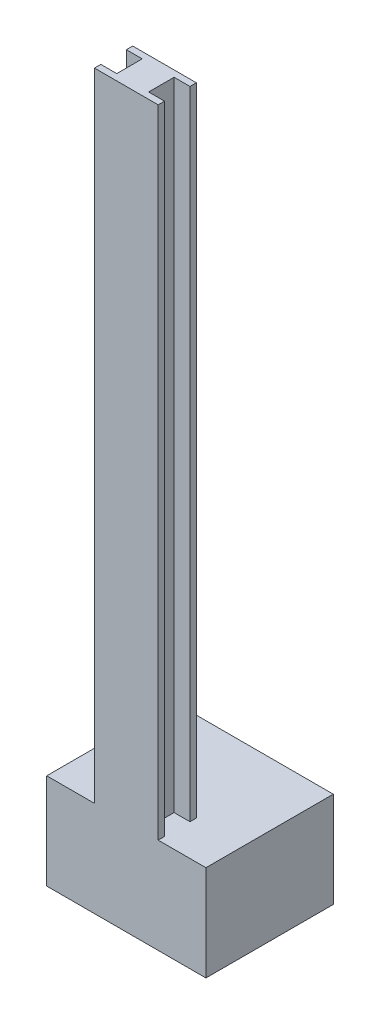
ISO-10303-21;
HEADER;
FILE_DESCRIPTION(('STEP AP214'),'2;1');
FILE_NAME('part.step','',(''),(''),'','','');
FILE_SCHEMA(('AUTOMOTIVE_DESIGN { 1 0 10303 214 1 1 1 1 }'));
ENDSEC;
DATA;
#1=APPLICATION_CONTEXT('core data for automotive mechanical design processes');
#2=APPLICATION_PROTOCOL_DEFINITION('international standard','automotive_design',2000,#1);
#3=PRODUCT_CONTEXT('',#1,'mechanical');
#4=PRODUCT('Part','Part','',(#3));
#5=PRODUCT_RELATED_PRODUCT_CATEGORY('part','',(#4));
#6=PRODUCT_DEFINITION_FORMATION('','',#4);
#7=PRODUCT_DEFINITION_CONTEXT('part definition',#1,'design');
#8=PRODUCT_DEFINITION('design','',#6,#7);
#9=PRODUCT_DEFINITION_SHAPE('','',#8);
#10=(LENGTH_UNIT() NAMED_UNIT(*) SI_UNIT(.MILLI.,.METRE.));
#11=(NAMED_UNIT(*) PLANE_ANGLE_UNIT() SI_UNIT($,.RADIAN.));
#12=(NAMED_UNIT(*) SI_UNIT($,.STERADIAN.) SOLID_ANGLE_UNIT());
#13=UNCERTAINTY_MEASURE_WITH_UNIT(LENGTH_MEASURE(1.E-05),#10,'distance_accuracy_value','');
#14=(GEOMETRIC_REPRESENTATION_CONTEXT(3) GLOBAL_UNCERTAINTY_ASSIGNED_CONTEXT((#13)) GLOBAL_UNIT_ASSIGNED_CONTEXT((#10,
#11,#12)) REPRESENTATION_CONTEXT('',''));
#15=CARTESIAN_POINT('',(0.,0.,0.));
#16=DIRECTION('',(0.,0.,1.));
#17=DIRECTION('',(1.,0.,0.));
#18=AXIS2_PLACEMENT_3D('',#15,#16,#17);
#19=CARTESIAN_POINT('',(0.,30.,0.));
#20=DIRECTION('',(0.,-1.,0.));
#21=DIRECTION('',(0.,0.,-1.));
#22=AXIS2_PLACEMENT_3D('',#19,#20,#21);
#23=PLANE('',#22);
#24=DIRECTION('',(0.,0.,1.));
#25=VECTOR('',#24,1.);
#26=CARTESIAN_POINT('',(-10.,30.,20.));
#27=LINE('',#26,#25);
#28=CARTESIAN_POINT('',(-10.,30.,18.));
#29=VERTEX_POINT('',#28);
#30=CARTESIAN_POINT('',(-10.,30.,20.));
#31=VERTEX_POINT('',#30);
#32=EDGE_CURVE('E59',#29,#31,#27,.T.);
#33=ORIENTED_EDGE('',*,*,#32,.F.);
#34=DIRECTION('',(-1.,0.,0.));
#35=VECTOR('',#34,1.);
#36=CARTESIAN_POINT('',(-5.,30.,18.));
#37=LINE('',#36,#35);
#38=CARTESIAN_POINT('',(-5.,30.,18.));
#39=VERTEX_POINT('',#38);
#40=EDGE_CURVE('E63',#39,#29,#37,.T.);
#41=ORIENTED_EDGE('',*,*,#40,.F.);
#42=DIRECTION('',(0.,0.,1.));
#43=VECTOR('',#42,1.);
#44=CARTESIAN_POINT('',(-5.,30.,10.));
#45=LINE('',#44,#43);
#46=CARTESIAN_POINT('',(-5.,30.,10.));
#47=VERTEX_POINT('',#46);
#48=EDGE_CURVE('E308',#47,#39,#45,.T.);
#49=ORIENTED_EDGE('',*,*,#48,.F.);
#50=DIRECTION('',(1.,0.,0.));
#51=VECTOR('',#50,1.);
#52=CARTESIAN_POINT('',(-10.,30.,10.));
#53=LINE('',#52,#51);
#54=CARTESIAN_POINT('',(-10.,30.,10.));
#55=VERTEX_POINT('',#54);
#56=EDGE_CURVE('E304',#55,#47,#53,.T.);
#57=ORIENTED_EDGE('',*,*,#56,.F.);
#58=DIRECTION('',(0.,0.,1.));
#59=VECTOR('',#58,1.);
#60=CARTESIAN_POINT('',(-10.,30.,10.));
#61=LINE('',#60,#59);
#62=CARTESIAN_POINT('',(-10.,30.,8.));
#63=VERTEX_POINT('',#62);
#64=EDGE_CURVE('E300',#63,#55,#61,.T.);
#65=ORIENTED_EDGE('',*,*,#64,.F.);
#66=DIRECTION('',(-1.,0.,0.));
#67=VECTOR('',#66,1.);
#68=CARTESIAN_POINT('',(-10.,30.,8.));
#69=LINE('',#68,#67);
#70=CARTESIAN_POINT('',(10.,30.,8.));
#71=VERTEX_POINT('',#70);
#72=EDGE_CURVE('E296',#71,#63,#69,.T.);
#73=ORIENTED_EDGE('',*,*,#72,.F.);
#74=DIRECTION('',(0.,0.,-1.));
#75=VECTOR('',#74,1.);
#76=CARTESIAN_POINT('',(10.,30.,10.));
#77=LINE('',#76,#75);
#78=CARTESIAN_POINT('',(10.,30.,10.));
#79=VERTEX_POINT('',#78);
#80=EDGE_CURVE('E292',#79,#71,#77,.T.);
#81=ORIENTED_EDGE('',*,*,#80,.F.);
#82=DIRECTION('',(1.,0.,0.));
#83=VECTOR('',#82,1.);
#84=CARTESIAN_POINT('',(10.,30.,10.));
#85=LINE('',#84,#83);
#86=CARTESIAN_POINT('',(5.,30.,10.));
#87=VERTEX_POINT('',#86);
#88=EDGE_CURVE('E288',#87,#79,#85,.T.);
#89=ORIENTED_EDGE('',*,*,#88,.F.);
#90=DIRECTION('',(0.,0.,-1.));
#91=VECTOR('',#90,1.);
#92=CARTESIAN_POINT('',(5.,30.,10.));
#93=LINE('',#92,#91);
#94=CARTESIAN_POINT('',(5.,30.,18.));
#95=VERTEX_POINT('',#94);
#96=EDGE_CURVE('E284',#95,#87,#93,.T.);
#97=ORIENTED_EDGE('',*,*,#96,.F.);
#98=DIRECTION('',(-1.,0.,0.));
#99=VECTOR('',#98,1.);
#100=CARTESIAN_POINT('',(5.,30.,18.));
#101=LINE('',#100,#99);
#102=CARTESIAN_POINT('',(10.,30.,18.));
#103=VERTEX_POINT('',#102);
#104=EDGE_CURVE('E280',#103,#95,#101,.T.);
#105=ORIENTED_EDGE('',*,*,#104,.F.);
#106=DIRECTION('',(0.,0.,-1.));
#107=VECTOR('',#106,1.);
#108=CARTESIAN_POINT('',(10.,30.,20.));
#109=LINE('',#108,#107);
#110=CARTESIAN_POINT('',(10.,30.,20.));
#111=VERTEX_POINT('',#110);
#112=EDGE_CURVE('E239',#111,#103,#109,.T.);
#113=ORIENTED_EDGE('',*,*,#112,.F.);
#114=DIRECTION('',(1.,0.,0.));
#115=VECTOR('',#114,1.);
#116=CARTESIAN_POINT('',(-25.,30.,20.));
#117=LINE('',#116,#115);
#118=CARTESIAN_POINT('',(25.,30.,20.));
#119=VERTEX_POINT('',#118);
#120=EDGE_CURVE('E203',#111,#119,#117,.T.);
#121=ORIENTED_EDGE('',*,*,#120,.T.);
#122=DIRECTION('',(0.,0.,-1.));
#123=VECTOR('',#122,1.);
#124=CARTESIAN_POINT('',(25.,30.,20.));
#125=LINE('',#124,#123);
#126=CARTESIAN_POINT('',(25.,30.,-20.));
#127=VERTEX_POINT('',#126);
#128=EDGE_CURVE('E192',#119,#127,#125,.T.);
#129=ORIENTED_EDGE('',*,*,#128,.T.);
#130=DIRECTION('',(-1.,0.,0.));
#131=VECTOR('',#130,1.);
#132=CARTESIAN_POINT('',(-25.,30.,-20.));
#133=LINE('',#132,#131);
#134=CARTESIAN_POINT('',(-25.,30.,-20.));
#135=VERTEX_POINT('',#134);
#136=EDGE_CURVE('E196',#127,#135,#133,.T.);
#137=ORIENTED_EDGE('',*,*,#136,.T.);
#138=DIRECTION('',(0.,0.,1.));
#139=VECTOR('',#138,1.);
#140=CARTESIAN_POINT('',(-25.,30.,20.));
#141=LINE('',#140,#139);
#142=CARTESIAN_POINT('',(-25.,30.,20.));
#143=VERTEX_POINT('',#142);
#144=EDGE_CURVE('E200',#135,#143,#141,.T.);
#145=ORIENTED_EDGE('',*,*,#144,.T.);
#146=EDGE_CURVE('E204',#143,#31,#117,.T.);
#147=ORIENTED_EDGE('',*,*,#146,.T.);
#148=EDGE_LOOP('',(#33,#41,#49,#57,#65,#73,#81,#89,#97,#105,#113,#121,#129,#137,#145,#147));
#149=FACE_BOUND('',#148,.T.);
#150=ADVANCED_FACE('F43',(#149),#23,.F.);
#151=CARTESIAN_POINT('',(25.,30.,20.));
#152=DIRECTION('',(-1.,0.,0.));
#153=DIRECTION('',(0.,0.,1.));
#154=AXIS2_PLACEMENT_3D('',#151,#152,#153);
#155=PLANE('',#154);
#156=DIRECTION('',(0.,0.,-1.));
#157=VECTOR('',#156,1.);
#158=CARTESIAN_POINT('',(25.,0.,20.));
#159=LINE('',#158,#157);
#160=CARTESIAN_POINT('',(25.,0.,20.));
#161=VERTEX_POINT('',#160);
#162=CARTESIAN_POINT('',(25.,0.,-20.));
#163=VERTEX_POINT('',#162);
#164=EDGE_CURVE('E181',#161,#163,#159,.T.);
#165=ORIENTED_EDGE('',*,*,#164,.T.);
#166=DIRECTION('',(0.,-1.,0.));
#167=VECTOR('',#166,1.);
#168=CARTESIAN_POINT('',(25.,30.,-20.));
#169=LINE('',#168,#167);
#170=EDGE_CURVE('E11',#127,#163,#169,.T.);
#171=ORIENTED_EDGE('',*,*,#170,.F.);
#172=ORIENTED_EDGE('',*,*,#128,.F.);
#173=DIRECTION('',(0.,-1.,0.));
#174=VECTOR('',#173,1.);
#175=CARTESIAN_POINT('',(25.,30.,20.));
#176=LINE('',#175,#174);
#177=EDGE_CURVE('E206',#119,#161,#176,.T.);
#178=ORIENTED_EDGE('',*,*,#177,.T.);
#179=EDGE_LOOP('',(#165,#171,#172,#178));
#180=FACE_BOUND('',#179,.T.);
#181=ADVANCED_FACE('F45',(#180),#155,.F.);
#182=CARTESIAN_POINT('',(-25.,30.,-20.));
#183=DIRECTION('',(0.,0.,1.));
#184=DIRECTION('',(1.,0.,0.));
#185=AXIS2_PLACEMENT_3D('',#182,#183,#184);
#186=PLANE('',#185);
#187=DIRECTION('',(-1.,0.,0.));
#188=VECTOR('',#187,1.);
#189=CARTESIAN_POINT('',(-25.,0.,-20.));
#190=LINE('',#189,#188);
#191=CARTESIAN_POINT('',(-25.,0.,-20.));
#192=VERTEX_POINT('',#191);
#193=EDGE_CURVE('E186',#163,#192,#190,.T.);
#194=ORIENTED_EDGE('',*,*,#193,.T.);
#195=DIRECTION('',(0.,-1.,0.));
#196=VECTOR('',#195,1.);
#197=CARTESIAN_POINT('',(-25.,30.,-20.));
#198=LINE('',#197,#196);
#199=EDGE_CURVE('E52',#135,#192,#198,.T.);
#200=ORIENTED_EDGE('',*,*,#199,.F.);
#201=ORIENTED_EDGE('',*,*,#136,.F.);
#202=ORIENTED_EDGE('',*,*,#170,.T.);
#203=EDGE_LOOP('',(#194,#200,#201,#202));
#204=FACE_BOUND('',#203,.T.);
#205=ADVANCED_FACE('F393',(#204),#186,.F.);
#206=CARTESIAN_POINT('',(-25.,30.,20.));
#207=DIRECTION('',(1.,0.,0.));
#208=DIRECTION('',(0.,0.,-1.));
#209=AXIS2_PLACEMENT_3D('',#206,#207,#208);
#210=PLANE('',#209);
#211=DIRECTION('',(0.,0.,1.));
#212=VECTOR('',#211,1.);
#213=CARTESIAN_POINT('',(-25.,0.,20.));
#214=LINE('',#213,#212);
#215=CARTESIAN_POINT('',(-25.,0.,20.));
#216=VERTEX_POINT('',#215);
#217=EDGE_CURVE('E210',#192,#216,#214,.T.);
#218=ORIENTED_EDGE('',*,*,#217,.T.);
#219=DIRECTION('',(0.,-1.,0.));
#220=VECTOR('',#219,1.);
#221=CARTESIAN_POINT('',(-25.,30.,20.));
#222=LINE('',#221,#220);
#223=EDGE_CURVE('E218',#143,#216,#222,.T.);
#224=ORIENTED_EDGE('',*,*,#223,.F.);
#225=ORIENTED_EDGE('',*,*,#144,.F.);
#226=ORIENTED_EDGE('',*,*,#199,.T.);
#227=EDGE_LOOP('',(#218,#224,#225,#226));
#228=FACE_BOUND('',#227,.T.);
#229=ADVANCED_FACE('F227',(#228),#210,.F.);
#230=CARTESIAN_POINT('',(-25.,30.,20.));
#231=DIRECTION('',(0.,0.,-1.));
#232=DIRECTION('',(-1.,0.,0.));
#233=AXIS2_PLACEMENT_3D('',#230,#231,#232);
#234=PLANE('',#233);
#235=DIRECTION('',(1.,0.,0.));
#236=VECTOR('',#235,1.);
#237=CARTESIAN_POINT('',(-25.,0.,20.));
#238=LINE('',#237,#236);
#239=EDGE_CURVE('E197',#216,#161,#238,.T.);
#240=ORIENTED_EDGE('',*,*,#239,.T.);
#241=ORIENTED_EDGE('',*,*,#177,.F.);
#242=ORIENTED_EDGE('',*,*,#120,.F.);
#243=DIRECTION('',(0.,-1.,0.));
#244=VECTOR('',#243,1.);
#245=CARTESIAN_POINT('',(10.,230.,20.));
#246=LINE('',#245,#244);
#247=CARTESIAN_POINT('',(10.,230.,20.));
#248=VERTEX_POINT('',#247);
#249=EDGE_CURVE('E163',#248,#111,#246,.T.);
#250=ORIENTED_EDGE('',*,*,#249,.F.);
#251=DIRECTION('',(1.,0.,0.));
#252=VECTOR('',#251,1.);
#253=CARTESIAN_POINT('',(-10.,230.,20.));
#254=LINE('',#253,#252);
#255=CARTESIAN_POINT('',(-10.,230.,20.));
#256=VERTEX_POINT('',#255);
#257=EDGE_CURVE('E155',#256,#248,#254,.T.);
#258=ORIENTED_EDGE('',*,*,#257,.F.);
#259=DIRECTION('',(0.,-1.,0.));
#260=VECTOR('',#259,1.);
#261=CARTESIAN_POINT('',(-10.,230.,20.));
#262=LINE('',#261,#260);
#263=EDGE_CURVE('E160',#256,#31,#262,.T.);
#264=ORIENTED_EDGE('',*,*,#263,.T.);
#265=ORIENTED_EDGE('',*,*,#146,.F.);
#266=ORIENTED_EDGE('',*,*,#223,.T.);
#267=EDGE_LOOP('',(#240,#241,#242,#250,#258,#264,#265,#266));
#268=FACE_BOUND('',#267,.T.);
#269=ADVANCED_FACE('F157',(#268),#234,.F.);
#270=CARTESIAN_POINT('',(0.,0.,0.));
#271=DIRECTION('',(0.,-1.,0.));
#272=DIRECTION('',(0.,0.,-1.));
#273=AXIS2_PLACEMENT_3D('',#270,#271,#272);
#274=PLANE('',#273);
#275=ORIENTED_EDGE('',*,*,#164,.F.);
#276=ORIENTED_EDGE('',*,*,#239,.F.);
#277=ORIENTED_EDGE('',*,*,#217,.F.);
#278=ORIENTED_EDGE('',*,*,#193,.F.);
#279=EDGE_LOOP('',(#275,#276,#277,#278));
#280=FACE_BOUND('',#279,.T.);
#281=ADVANCED_FACE('F233',(#280),#274,.T.);
#282=CARTESIAN_POINT('',(-10.,230.,20.));
#283=DIRECTION('',(1.,0.,0.));
#284=DIRECTION('',(0.,0.,-1.));
#285=AXIS2_PLACEMENT_3D('',#282,#283,#284);
#286=PLANE('',#285);
#287=ORIENTED_EDGE('',*,*,#32,.T.);
#288=ORIENTED_EDGE('',*,*,#263,.F.);
#289=DIRECTION('',(0.,0.,1.));
#290=VECTOR('',#289,1.);
#291=CARTESIAN_POINT('',(-10.,230.,20.));
#292=LINE('',#291,#290);
#293=CARTESIAN_POINT('',(-10.,230.,18.));
#294=VERTEX_POINT('',#293);
#295=EDGE_CURVE('E168',#294,#256,#292,.T.);
#296=ORIENTED_EDGE('',*,*,#295,.F.);
#297=DIRECTION('',(0.,-1.,0.));
#298=VECTOR('',#297,1.);
#299=CARTESIAN_POINT('',(-10.,230.,18.));
#300=LINE('',#299,#298);
#301=EDGE_CURVE('E275',#294,#29,#300,.T.);
#302=ORIENTED_EDGE('',*,*,#301,.T.);
#303=EDGE_LOOP('',(#287,#288,#296,#302));
#304=FACE_BOUND('',#303,.T.);
#305=ADVANCED_FACE('F179',(#304),#286,.F.);
#306=CARTESIAN_POINT('',(10.,230.,20.));
#307=DIRECTION('',(-1.,0.,0.));
#308=DIRECTION('',(0.,0.,1.));
#309=AXIS2_PLACEMENT_3D('',#306,#307,#308);
#310=PLANE('',#309);
#311=ORIENTED_EDGE('',*,*,#112,.T.);
#312=DIRECTION('',(0.,-1.,0.));
#313=VECTOR('',#312,1.);
#314=CARTESIAN_POINT('',(10.,230.,18.));
#315=LINE('',#314,#313);
#316=CARTESIAN_POINT('',(10.,230.,18.));
#317=VERTEX_POINT('',#316);
#318=EDGE_CURVE('E188',#317,#103,#315,.T.);
#319=ORIENTED_EDGE('',*,*,#318,.F.);
#320=DIRECTION('',(0.,0.,-1.));
#321=VECTOR('',#320,1.);
#322=CARTESIAN_POINT('',(10.,230.,20.));
#323=LINE('',#322,#321);
#324=EDGE_CURVE('E167',#248,#317,#323,.T.);
#325=ORIENTED_EDGE('',*,*,#324,.F.);
#326=ORIENTED_EDGE('',*,*,#249,.T.);
#327=EDGE_LOOP('',(#311,#319,#325,#326));
#328=FACE_BOUND('',#327,.T.);
#329=ADVANCED_FACE('F242',(#328),#310,.F.);
#330=CARTESIAN_POINT('',(5.,230.,18.));
#331=DIRECTION('',(0.,0.,1.));
#332=DIRECTION('',(1.,0.,0.));
#333=AXIS2_PLACEMENT_3D('',#330,#331,#332);
#334=PLANE('',#333);
#335=ORIENTED_EDGE('',*,*,#104,.T.);
#336=DIRECTION('',(0.,-1.,0.));
#337=VECTOR('',#336,1.);
#338=CARTESIAN_POINT('',(5.,230.,18.));
#339=LINE('',#338,#337);
#340=CARTESIAN_POINT('',(5.,230.,18.));
#341=VERTEX_POINT('',#340);
#342=EDGE_CURVE('E343',#341,#95,#339,.T.);
#343=ORIENTED_EDGE('',*,*,#342,.F.);
#344=DIRECTION('',(-1.,0.,0.));
#345=VECTOR('',#344,1.);
#346=CARTESIAN_POINT('',(5.,230.,18.));
#347=LINE('',#346,#345);
#348=EDGE_CURVE('E247',#317,#341,#347,.T.);
#349=ORIENTED_EDGE('',*,*,#348,.F.);
#350=ORIENTED_EDGE('',*,*,#318,.T.);
#351=EDGE_LOOP('',(#335,#343,#349,#350));
#352=FACE_BOUND('',#351,.T.);
#353=ADVANCED_FACE('F348',(#352),#334,.F.);
#354=CARTESIAN_POINT('',(5.,230.,10.));
#355=DIRECTION('',(-1.,0.,0.));
#356=DIRECTION('',(0.,0.,1.));
#357=AXIS2_PLACEMENT_3D('',#354,#355,#356);
#358=PLANE('',#357);
#359=ORIENTED_EDGE('',*,*,#96,.T.);
#360=DIRECTION('',(0.,-1.,0.));
#361=VECTOR('',#360,1.);
#362=CARTESIAN_POINT('',(5.,230.,10.));
#363=LINE('',#362,#361);
#364=CARTESIAN_POINT('',(5.,230.,10.));
#365=VERTEX_POINT('',#364);
#366=EDGE_CURVE('E339',#365,#87,#363,.T.);
#367=ORIENTED_EDGE('',*,*,#366,.F.);
#368=DIRECTION('',(0.,0.,-1.));
#369=VECTOR('',#368,1.);
#370=CARTESIAN_POINT('',(5.,230.,10.));
#371=LINE('',#370,#369);
#372=EDGE_CURVE('E250',#341,#365,#371,.T.);
#373=ORIENTED_EDGE('',*,*,#372,.F.);
#374=ORIENTED_EDGE('',*,*,#342,.T.);
#375=EDGE_LOOP('',(#359,#367,#373,#374));
#376=FACE_BOUND('',#375,.T.);
#377=ADVANCED_FACE('F355',(#376),#358,.F.);
#378=CARTESIAN_POINT('',(10.,230.,10.));
#379=DIRECTION('',(0.,0.,-1.));
#380=DIRECTION('',(-1.,0.,0.));
#381=AXIS2_PLACEMENT_3D('',#378,#379,#380);
#382=PLANE('',#381);
#383=ORIENTED_EDGE('',*,*,#88,.T.);
#384=DIRECTION('',(0.,-1.,0.));
#385=VECTOR('',#384,1.);
#386=CARTESIAN_POINT('',(10.,230.,10.));
#387=LINE('',#386,#385);
#388=CARTESIAN_POINT('',(10.,230.,10.));
#389=VERTEX_POINT('',#388);
#390=EDGE_CURVE('E335',#389,#79,#387,.T.);
#391=ORIENTED_EDGE('',*,*,#390,.F.);
#392=DIRECTION('',(1.,0.,0.));
#393=VECTOR('',#392,1.);
#394=CARTESIAN_POINT('',(10.,230.,10.));
#395=LINE('',#394,#393);
#396=EDGE_CURVE('E255',#365,#389,#395,.T.);
#397=ORIENTED_EDGE('',*,*,#396,.F.);
#398=ORIENTED_EDGE('',*,*,#366,.T.);
#399=EDGE_LOOP('',(#383,#391,#397,#398));
#400=FACE_BOUND('',#399,.T.);
#401=ADVANCED_FACE('F357',(#400),#382,.F.);
#402=CARTESIAN_POINT('',(10.,230.,10.));
#403=DIRECTION('',(-1.,0.,0.));
#404=DIRECTION('',(0.,0.,1.));
#405=AXIS2_PLACEMENT_3D('',#402,#403,#404);
#406=PLANE('',#405);
#407=ORIENTED_EDGE('',*,*,#80,.T.);
#408=DIRECTION('',(0.,-1.,0.));
#409=VECTOR('',#408,1.);
#410=CARTESIAN_POINT('',(10.,230.,8.));
#411=LINE('',#410,#409);
#412=CARTESIAN_POINT('',(10.,230.,8.));
#413=VERTEX_POINT('',#412);
#414=EDGE_CURVE('E331',#413,#71,#411,.T.);
#415=ORIENTED_EDGE('',*,*,#414,.F.);
#416=DIRECTION('',(0.,0.,-1.));
#417=VECTOR('',#416,1.);
#418=CARTESIAN_POINT('',(10.,230.,10.));
#419=LINE('',#418,#417);
#420=EDGE_CURVE('E258',#389,#413,#419,.T.);
#421=ORIENTED_EDGE('',*,*,#420,.F.);
#422=ORIENTED_EDGE('',*,*,#390,.T.);
#423=EDGE_LOOP('',(#407,#415,#421,#422));
#424=FACE_BOUND('',#423,.T.);
#425=ADVANCED_FACE('F361',(#424),#406,.F.);
#426=CARTESIAN_POINT('',(-10.,230.,8.));
#427=DIRECTION('',(0.,0.,1.));
#428=DIRECTION('',(1.,0.,0.));
#429=AXIS2_PLACEMENT_3D('',#426,#427,#428);
#430=PLANE('',#429);
#431=ORIENTED_EDGE('',*,*,#72,.T.);
#432=DIRECTION('',(0.,-1.,0.));
#433=VECTOR('',#432,1.);
#434=CARTESIAN_POINT('',(-10.,230.,8.));
#435=LINE('',#434,#433);
#436=CARTESIAN_POINT('',(-10.,230.,8.));
#437=VERTEX_POINT('',#436);
#438=EDGE_CURVE('E327',#437,#63,#435,.T.);
#439=ORIENTED_EDGE('',*,*,#438,.F.);
#440=DIRECTION('',(-1.,0.,0.));
#441=VECTOR('',#440,1.);
#442=CARTESIAN_POINT('',(-10.,230.,8.));
#443=LINE('',#442,#441);
#444=EDGE_CURVE('E261',#413,#437,#443,.T.);
#445=ORIENTED_EDGE('',*,*,#444,.F.);
#446=ORIENTED_EDGE('',*,*,#414,.T.);
#447=EDGE_LOOP('',(#431,#439,#445,#446));
#448=FACE_BOUND('',#447,.T.);
#449=ADVANCED_FACE('F367',(#448),#430,.F.);
#450=CARTESIAN_POINT('',(-10.,230.,10.));
#451=DIRECTION('',(1.,0.,0.));
#452=DIRECTION('',(0.,0.,-1.));
#453=AXIS2_PLACEMENT_3D('',#450,#451,#452);
#454=PLANE('',#453);
#455=ORIENTED_EDGE('',*,*,#64,.T.);
#456=DIRECTION('',(0.,-1.,0.));
#457=VECTOR('',#456,1.);
#458=CARTESIAN_POINT('',(-10.,230.,10.));
#459=LINE('',#458,#457);
#460=CARTESIAN_POINT('',(-10.,230.,10.));
#461=VERTEX_POINT('',#460);
#462=EDGE_CURVE('E323',#461,#55,#459,.T.);
#463=ORIENTED_EDGE('',*,*,#462,.F.);
#464=DIRECTION('',(0.,0.,1.));
#465=VECTOR('',#464,1.);
#466=CARTESIAN_POINT('',(-10.,230.,10.));
#467=LINE('',#466,#465);
#468=EDGE_CURVE('E264',#437,#461,#467,.T.);
#469=ORIENTED_EDGE('',*,*,#468,.F.);
#470=ORIENTED_EDGE('',*,*,#438,.T.);
#471=EDGE_LOOP('',(#455,#463,#469,#470));
#472=FACE_BOUND('',#471,.T.);
#473=ADVANCED_FACE('F369',(#472),#454,.F.);
#474=CARTESIAN_POINT('',(-10.,230.,10.));
#475=DIRECTION('',(0.,0.,-1.));
#476=DIRECTION('',(-1.,0.,0.));
#477=AXIS2_PLACEMENT_3D('',#474,#475,#476);
#478=PLANE('',#477);
#479=ORIENTED_EDGE('',*,*,#56,.T.);
#480=DIRECTION('',(0.,-1.,0.));
#481=VECTOR('',#480,1.);
#482=CARTESIAN_POINT('',(-5.,230.,10.));
#483=LINE('',#482,#481);
#484=CARTESIAN_POINT('',(-5.,230.,10.));
#485=VERTEX_POINT('',#484);
#486=EDGE_CURVE('E319',#485,#47,#483,.T.);
#487=ORIENTED_EDGE('',*,*,#486,.F.);
#488=DIRECTION('',(1.,0.,0.));
#489=VECTOR('',#488,1.);
#490=CARTESIAN_POINT('',(-10.,230.,10.));
#491=LINE('',#490,#489);
#492=EDGE_CURVE('E267',#461,#485,#491,.T.);
#493=ORIENTED_EDGE('',*,*,#492,.F.);
#494=ORIENTED_EDGE('',*,*,#462,.T.);
#495=EDGE_LOOP('',(#479,#487,#493,#494));
#496=FACE_BOUND('',#495,.T.);
#497=ADVANCED_FACE('F373',(#496),#478,.F.);
#498=CARTESIAN_POINT('',(-5.,230.,10.));
#499=DIRECTION('',(1.,0.,0.));
#500=DIRECTION('',(0.,0.,-1.));
#501=AXIS2_PLACEMENT_3D('',#498,#499,#500);
#502=PLANE('',#501);
#503=ORIENTED_EDGE('',*,*,#48,.T.);
#504=DIRECTION('',(0.,-1.,0.));
#505=VECTOR('',#504,1.);
#506=CARTESIAN_POINT('',(-5.,230.,18.));
#507=LINE('',#506,#505);
#508=CARTESIAN_POINT('',(-5.,230.,18.));
#509=VERTEX_POINT('',#508);
#510=EDGE_CURVE('E315',#509,#39,#507,.T.);
#511=ORIENTED_EDGE('',*,*,#510,.F.);
#512=DIRECTION('',(0.,0.,1.));
#513=VECTOR('',#512,1.);
#514=CARTESIAN_POINT('',(-5.,230.,10.));
#515=LINE('',#514,#513);
#516=EDGE_CURVE('E270',#485,#509,#515,.T.);
#517=ORIENTED_EDGE('',*,*,#516,.F.);
#518=ORIENTED_EDGE('',*,*,#486,.T.);
#519=EDGE_LOOP('',(#503,#511,#517,#518));
#520=FACE_BOUND('',#519,.T.);
#521=ADVANCED_FACE('F377',(#520),#502,.F.);
#522=CARTESIAN_POINT('',(-5.,230.,18.));
#523=DIRECTION('',(0.,0.,1.));
#524=DIRECTION('',(1.,0.,0.));
#525=AXIS2_PLACEMENT_3D('',#522,#523,#524);
#526=PLANE('',#525);
#527=ORIENTED_EDGE('',*,*,#40,.T.);
#528=ORIENTED_EDGE('',*,*,#301,.F.);
#529=DIRECTION('',(-1.,0.,0.));
#530=VECTOR('',#529,1.);
#531=CARTESIAN_POINT('',(-5.,230.,18.));
#532=LINE('',#531,#530);
#533=EDGE_CURVE('E173',#509,#294,#532,.T.);
#534=ORIENTED_EDGE('',*,*,#533,.F.);
#535=ORIENTED_EDGE('',*,*,#510,.T.);
#536=EDGE_LOOP('',(#527,#528,#534,#535));
#537=FACE_BOUND('',#536,.T.);
#538=ADVANCED_FACE('F379',(#537),#526,.F.);
#539=CARTESIAN_POINT('',(0.,230.,0.));
#540=DIRECTION('',(0.,1.,0.));
#541=DIRECTION('',(0.,0.,1.));
#542=AXIS2_PLACEMENT_3D('',#539,#540,#541);
#543=PLANE('',#542);
#544=ORIENTED_EDGE('',*,*,#295,.T.);
#545=ORIENTED_EDGE('',*,*,#257,.T.);
#546=ORIENTED_EDGE('',*,*,#324,.T.);
#547=ORIENTED_EDGE('',*,*,#348,.T.);
#548=ORIENTED_EDGE('',*,*,#372,.T.);
#549=ORIENTED_EDGE('',*,*,#396,.T.);
#550=ORIENTED_EDGE('',*,*,#420,.T.);
#551=ORIENTED_EDGE('',*,*,#444,.T.);
#552=ORIENTED_EDGE('',*,*,#468,.T.);
#553=ORIENTED_EDGE('',*,*,#492,.T.);
#554=ORIENTED_EDGE('',*,*,#516,.T.);
#555=ORIENTED_EDGE('',*,*,#533,.T.);
#556=EDGE_LOOP('',(#544,#545,#546,#547,#548,#549,#550,#551,#552,#553,#554,#555));
#557=FACE_BOUND('',#556,.T.);
#558=ADVANCED_FACE('F171',(#557),#543,.T.);
#559=CLOSED_SHELL('',(#150,#181,#205,#229,#269,#281,#305,#329,#353,#377,#401,#425,#449,#473,
#497,#521,#538,#558));
#560=MANIFOLD_SOLID_BREP('B2',#559);
#561=ADVANCED_BREP_SHAPE_REPRESENTATION('',(#18,#560),#14);
#562=SHAPE_DEFINITION_REPRESENTATION(#9,#561);
ENDSEC;
END-ISO-10303-21;
